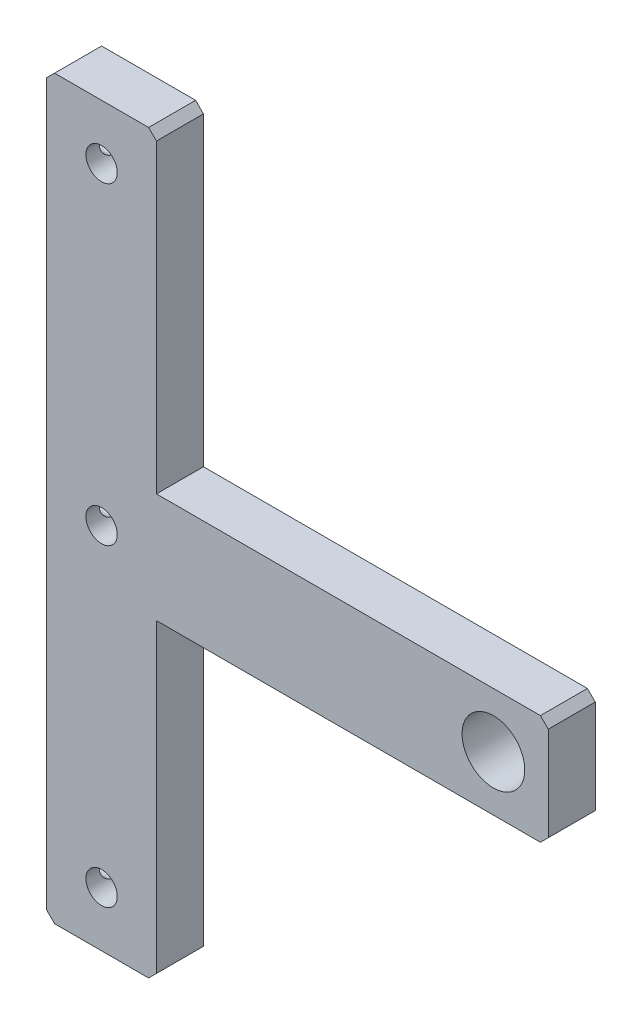
ISO-10303-21;
HEADER;
FILE_DESCRIPTION(('STEP AP214'),'2;1');
FILE_NAME('part.step','',(''),(''),'','','');
FILE_SCHEMA(('AUTOMOTIVE_DESIGN { 1 0 10303 214 1 1 1 1 }'));
ENDSEC;
DATA;
#1=APPLICATION_CONTEXT('core data for automotive mechanical design processes');
#2=APPLICATION_PROTOCOL_DEFINITION('international standard','automotive_design',2000,#1);
#3=PRODUCT_CONTEXT('',#1,'mechanical');
#4=PRODUCT('Part','Part','',(#3));
#5=PRODUCT_RELATED_PRODUCT_CATEGORY('part','',(#4));
#6=PRODUCT_DEFINITION_FORMATION('','',#4);
#7=PRODUCT_DEFINITION_CONTEXT('part definition',#1,'design');
#8=PRODUCT_DEFINITION('design','',#6,#7);
#9=PRODUCT_DEFINITION_SHAPE('','',#8);
#10=(LENGTH_UNIT() NAMED_UNIT(*) SI_UNIT(.MILLI.,.METRE.));
#11=(NAMED_UNIT(*) PLANE_ANGLE_UNIT() SI_UNIT($,.RADIAN.));
#12=(NAMED_UNIT(*) SI_UNIT($,.STERADIAN.) SOLID_ANGLE_UNIT());
#13=UNCERTAINTY_MEASURE_WITH_UNIT(LENGTH_MEASURE(1.E-05),#10,'distance_accuracy_value','');
#14=(GEOMETRIC_REPRESENTATION_CONTEXT(3) GLOBAL_UNCERTAINTY_ASSIGNED_CONTEXT((#13)) GLOBAL_UNIT_ASSIGNED_CONTEXT((#10,
#11,#12)) REPRESENTATION_CONTEXT('',''));
#15=CARTESIAN_POINT('',(0.,0.,0.));
#16=DIRECTION('',(0.,0.,1.));
#17=DIRECTION('',(1.,0.,0.));
#18=AXIS2_PLACEMENT_3D('',#15,#16,#17);
#19=CARTESIAN_POINT('',(0.,-47.,6.));
#20=DIRECTION('',(1.,0.,0.));
#21=DIRECTION('',(0.,1.,0.));
#22=AXIS2_PLACEMENT_3D('',#19,#20,#21);
#23=PLANE('',#22);
#24=DIRECTION('',(0.,-1.,0.));
#25=VECTOR('',#24,1.);
#26=CARTESIAN_POINT('',(0.,-47.,0.));
#27=LINE('',#26,#25);
#28=CARTESIAN_POINT('',(0.,46.,0.));
#29=VERTEX_POINT('',#28);
#30=CARTESIAN_POINT('',(0.,-46.,0.));
#31=VERTEX_POINT('',#30);
#32=EDGE_CURVE('E192',#29,#31,#27,.T.);
#33=ORIENTED_EDGE('',*,*,#32,.T.);
#34=DIRECTION('',(0.,0.,1.));
#35=VECTOR('',#34,1.);
#36=CARTESIAN_POINT('',(0.,-46.,6.));
#37=LINE('',#36,#35);
#38=CARTESIAN_POINT('',(0.,-46.,6.));
#39=VERTEX_POINT('',#38);
#40=EDGE_CURVE('E227',#31,#39,#37,.T.);
#41=ORIENTED_EDGE('',*,*,#40,.T.);
#42=DIRECTION('',(0.,-1.,0.));
#43=VECTOR('',#42,1.);
#44=CARTESIAN_POINT('',(0.,-47.,6.));
#45=LINE('',#44,#43);
#46=CARTESIAN_POINT('',(0.,46.,6.));
#47=VERTEX_POINT('',#46);
#48=EDGE_CURVE('E273',#47,#39,#45,.T.);
#49=ORIENTED_EDGE('',*,*,#48,.F.);
#50=DIRECTION('',(0.,0.,-1.));
#51=VECTOR('',#50,1.);
#52=CARTESIAN_POINT('',(0.,46.,6.));
#53=LINE('',#52,#51);
#54=EDGE_CURVE('E224',#47,#29,#53,.T.);
#55=ORIENTED_EDGE('',*,*,#54,.T.);
#56=EDGE_LOOP('',(#33,#41,#49,#55));
#57=FACE_BOUND('',#56,.T.);
#58=CARTESIAN_POINT('',(0.,0.,3.));
#59=DIRECTION('',(-1.,0.,0.));
#60=DIRECTION('',(0.,0.,1.));
#61=AXIS2_PLACEMENT_3D('',#58,#59,#60);
#62=CIRCLE('',#61,1.24999999999999);
#63=CARTESIAN_POINT('',(0.,0.,4.24999999999999));
#64=VERTEX_POINT('',#63);
#65=EDGE_CURVE('E311',#64,#64,#62,.T.);
#66=ORIENTED_EDGE('',*,*,#65,.F.);
#67=EDGE_LOOP('',(#66));
#68=FACE_BOUND('',#67,.T.);
#69=CARTESIAN_POINT('',(0.,40.,3.));
#70=DIRECTION('',(-1.,0.,0.));
#71=DIRECTION('',(0.,0.,1.));
#72=AXIS2_PLACEMENT_3D('',#69,#70,#71);
#73=CIRCLE('',#72,1.24999999999999);
#74=CARTESIAN_POINT('',(0.,40.,4.24999999999999));
#75=VERTEX_POINT('',#74);
#76=EDGE_CURVE('E332',#75,#75,#73,.T.);
#77=ORIENTED_EDGE('',*,*,#76,.F.);
#78=EDGE_LOOP('',(#77));
#79=FACE_BOUND('',#78,.T.);
#80=CARTESIAN_POINT('',(0.,-40.,3.));
#81=DIRECTION('',(-1.,0.,0.));
#82=DIRECTION('',(0.,0.,1.));
#83=AXIS2_PLACEMENT_3D('',#80,#81,#82);
#84=CIRCLE('',#83,1.24999999999999);
#85=CARTESIAN_POINT('',(0.,-40.,4.24999999999999));
#86=VERTEX_POINT('',#85);
#87=EDGE_CURVE('E342',#86,#86,#84,.T.);
#88=ORIENTED_EDGE('',*,*,#87,.F.);
#89=EDGE_LOOP('',(#88));
#90=FACE_BOUND('',#89,.T.);
#91=ADVANCED_FACE('F47',(#57,#68,#79,#90),#23,.F.);
#92=CARTESIAN_POINT('',(14.,47.,6.));
#93=DIRECTION('',(-1.,0.,0.));
#94=DIRECTION('',(0.,-1.,0.));
#95=AXIS2_PLACEMENT_3D('',#92,#93,#94);
#96=PLANE('',#95);
#97=DIRECTION('',(0.,1.,0.));
#98=VECTOR('',#97,1.);
#99=CARTESIAN_POINT('',(14.,47.,0.));
#100=LINE('',#99,#98);
#101=CARTESIAN_POINT('',(14.,7.,0.));
#102=VERTEX_POINT('',#101);
#103=CARTESIAN_POINT('',(14.,46.,0.));
#104=VERTEX_POINT('',#103);
#105=EDGE_CURVE('E185',#102,#104,#100,.T.);
#106=ORIENTED_EDGE('',*,*,#105,.T.);
#107=DIRECTION('',(0.,0.,1.));
#108=VECTOR('',#107,1.);
#109=CARTESIAN_POINT('',(14.,46.,6.));
#110=LINE('',#109,#108);
#111=CARTESIAN_POINT('',(14.,46.,6.));
#112=VERTEX_POINT('',#111);
#113=EDGE_CURVE('E11',#104,#112,#110,.T.);
#114=ORIENTED_EDGE('',*,*,#113,.T.);
#115=DIRECTION('',(0.,1.,0.));
#116=VECTOR('',#115,1.);
#117=CARTESIAN_POINT('',(14.,47.,6.));
#118=LINE('',#117,#116);
#119=CARTESIAN_POINT('',(14.,7.,6.));
#120=VERTEX_POINT('',#119);
#121=EDGE_CURVE('E205',#120,#112,#118,.T.);
#122=ORIENTED_EDGE('',*,*,#121,.F.);
#123=DIRECTION('',(0.,0.,-1.));
#124=VECTOR('',#123,1.);
#125=CARTESIAN_POINT('',(14.,7.,6.));
#126=LINE('',#125,#124);
#127=EDGE_CURVE('E173',#120,#102,#126,.T.);
#128=ORIENTED_EDGE('',*,*,#127,.T.);
#129=EDGE_LOOP('',(#106,#114,#122,#128));
#130=FACE_BOUND('',#129,.T.);
#131=ADVANCED_FACE('F360',(#130),#96,.F.);
#132=CARTESIAN_POINT('',(0.,47.,6.));
#133=DIRECTION('',(0.,-1.,0.));
#134=DIRECTION('',(0.,0.,-1.));
#135=AXIS2_PLACEMENT_3D('',#132,#133,#134);
#136=PLANE('',#135);
#137=DIRECTION('',(-1.,0.,0.));
#138=VECTOR('',#137,1.);
#139=CARTESIAN_POINT('',(0.,47.,6.));
#140=LINE('',#139,#138);
#141=CARTESIAN_POINT('',(13.,47.,6.));
#142=VERTEX_POINT('',#141);
#143=CARTESIAN_POINT('',(0.999999999999984,47.,6.));
#144=VERTEX_POINT('',#143);
#145=EDGE_CURVE('E258',#142,#144,#140,.T.);
#146=ORIENTED_EDGE('',*,*,#145,.F.);
#147=DIRECTION('',(0.,0.,-1.));
#148=VECTOR('',#147,1.);
#149=CARTESIAN_POINT('',(13.,47.,6.));
#150=LINE('',#149,#148);
#151=CARTESIAN_POINT('',(13.,47.,0.));
#152=VERTEX_POINT('',#151);
#153=EDGE_CURVE('E56',#142,#152,#150,.T.);
#154=ORIENTED_EDGE('',*,*,#153,.T.);
#155=DIRECTION('',(-1.,0.,0.));
#156=VECTOR('',#155,1.);
#157=CARTESIAN_POINT('',(0.,47.,0.));
#158=LINE('',#157,#156);
#159=CARTESIAN_POINT('',(0.999999999999984,47.,0.));
#160=VERTEX_POINT('',#159);
#161=EDGE_CURVE('E188',#152,#160,#158,.T.);
#162=ORIENTED_EDGE('',*,*,#161,.T.);
#163=DIRECTION('',(0.,0.,1.));
#164=VECTOR('',#163,1.);
#165=CARTESIAN_POINT('',(0.999999999999984,47.,6.));
#166=LINE('',#165,#164);
#167=EDGE_CURVE('E249',#160,#144,#166,.T.);
#168=ORIENTED_EDGE('',*,*,#167,.T.);
#169=EDGE_LOOP('',(#146,#154,#162,#168));
#170=FACE_BOUND('',#169,.T.);
#171=ADVANCED_FACE('F255',(#170),#136,.F.);
#172=CARTESIAN_POINT('',(0.,-47.,6.));
#173=DIRECTION('',(0.,1.,0.));
#174=DIRECTION('',(0.,0.,1.));
#175=AXIS2_PLACEMENT_3D('',#172,#173,#174);
#176=PLANE('',#175);
#177=DIRECTION('',(1.,0.,0.));
#178=VECTOR('',#177,1.);
#179=CARTESIAN_POINT('',(0.,-47.,6.));
#180=LINE('',#179,#178);
#181=CARTESIAN_POINT('',(1.,-47.,6.));
#182=VERTEX_POINT('',#181);
#183=CARTESIAN_POINT('',(13.,-47.,6.));
#184=VERTEX_POINT('',#183);
#185=EDGE_CURVE('E162',#182,#184,#180,.T.);
#186=ORIENTED_EDGE('',*,*,#185,.F.);
#187=DIRECTION('',(0.,0.,-1.));
#188=VECTOR('',#187,1.);
#189=CARTESIAN_POINT('',(1.,-47.,6.));
#190=LINE('',#189,#188);
#191=CARTESIAN_POINT('',(1.,-47.,0.));
#192=VERTEX_POINT('',#191);
#193=EDGE_CURVE('E209',#182,#192,#190,.T.);
#194=ORIENTED_EDGE('',*,*,#193,.T.);
#195=DIRECTION('',(1.,0.,0.));
#196=VECTOR('',#195,1.);
#197=CARTESIAN_POINT('',(0.,-47.,0.));
#198=LINE('',#197,#196);
#199=CARTESIAN_POINT('',(13.,-47.,0.));
#200=VERTEX_POINT('',#199);
#201=EDGE_CURVE('E195',#192,#200,#198,.T.);
#202=ORIENTED_EDGE('',*,*,#201,.T.);
#203=DIRECTION('',(0.,0.,1.));
#204=VECTOR('',#203,1.);
#205=CARTESIAN_POINT('',(13.,-47.,6.));
#206=LINE('',#205,#204);
#207=EDGE_CURVE('E172',#200,#184,#206,.T.);
#208=ORIENTED_EDGE('',*,*,#207,.T.);
#209=EDGE_LOOP('',(#186,#194,#202,#208));
#210=FACE_BOUND('',#209,.T.);
#211=ADVANCED_FACE('F370',(#210),#176,.F.);
#212=CARTESIAN_POINT('',(14.,-47.,6.));
#213=DIRECTION('',(-1.,0.,0.));
#214=DIRECTION('',(0.,0.,1.));
#215=AXIS2_PLACEMENT_3D('',#212,#213,#214);
#216=PLANE('',#215);
#217=DIRECTION('',(0.,1.,0.));
#218=VECTOR('',#217,1.);
#219=CARTESIAN_POINT('',(14.,-47.,6.));
#220=LINE('',#219,#218);
#221=CARTESIAN_POINT('',(14.,-46.,6.));
#222=VERTEX_POINT('',#221);
#223=CARTESIAN_POINT('',(14.,-7.,6.));
#224=VERTEX_POINT('',#223);
#225=EDGE_CURVE('E149',#222,#224,#220,.T.);
#226=ORIENTED_EDGE('',*,*,#225,.F.);
#227=DIRECTION('',(0.,0.,-1.));
#228=VECTOR('',#227,1.);
#229=CARTESIAN_POINT('',(14.,-46.,6.));
#230=LINE('',#229,#228);
#231=CARTESIAN_POINT('',(14.,-46.,0.));
#232=VERTEX_POINT('',#231);
#233=EDGE_CURVE('E239',#222,#232,#230,.T.);
#234=ORIENTED_EDGE('',*,*,#233,.T.);
#235=DIRECTION('',(0.,1.,0.));
#236=VECTOR('',#235,1.);
#237=CARTESIAN_POINT('',(14.,-47.,0.));
#238=LINE('',#237,#236);
#239=CARTESIAN_POINT('',(14.,-7.,0.));
#240=VERTEX_POINT('',#239);
#241=EDGE_CURVE('E168',#232,#240,#238,.T.);
#242=ORIENTED_EDGE('',*,*,#241,.T.);
#243=DIRECTION('',(0.,0.,-1.));
#244=VECTOR('',#243,1.);
#245=CARTESIAN_POINT('',(14.,-7.,6.));
#246=LINE('',#245,#244);
#247=EDGE_CURVE('E165',#224,#240,#246,.T.);
#248=ORIENTED_EDGE('',*,*,#247,.F.);
#249=EDGE_LOOP('',(#226,#234,#242,#248));
#250=FACE_BOUND('',#249,.T.);
#251=ADVANCED_FACE('F166',(#250),#216,.F.);
#252=CARTESIAN_POINT('',(14.,-7.,6.));
#253=DIRECTION('',(0.,1.,0.));
#254=DIRECTION('',(0.,0.,1.));
#255=AXIS2_PLACEMENT_3D('',#252,#253,#254);
#256=PLANE('',#255);
#257=DIRECTION('',(1.,0.,0.));
#258=VECTOR('',#257,1.);
#259=CARTESIAN_POINT('',(14.,-7.,0.));
#260=LINE('',#259,#258);
#261=CARTESIAN_POINT('',(63.,-7.,0.));
#262=VERTEX_POINT('',#261);
#263=EDGE_CURVE('E199',#240,#262,#260,.T.);
#264=ORIENTED_EDGE('',*,*,#263,.T.);
#265=DIRECTION('',(0.,0.,1.));
#266=VECTOR('',#265,1.);
#267=CARTESIAN_POINT('',(63.,-7.,6.));
#268=LINE('',#267,#266);
#269=CARTESIAN_POINT('',(63.,-7.,6.));
#270=VERTEX_POINT('',#269);
#271=EDGE_CURVE('E177',#262,#270,#268,.T.);
#272=ORIENTED_EDGE('',*,*,#271,.T.);
#273=DIRECTION('',(1.,0.,0.));
#274=VECTOR('',#273,1.);
#275=CARTESIAN_POINT('',(14.,-7.,6.));
#276=LINE('',#275,#274);
#277=EDGE_CURVE('E154',#224,#270,#276,.T.);
#278=ORIENTED_EDGE('',*,*,#277,.F.);
#279=ORIENTED_EDGE('',*,*,#247,.T.);
#280=EDGE_LOOP('',(#264,#272,#278,#279));
#281=FACE_BOUND('',#280,.T.);
#282=ADVANCED_FACE('F175',(#281),#256,.F.);
#283=CARTESIAN_POINT('',(64.,7.,6.));
#284=DIRECTION('',(-1.,0.,0.));
#285=DIRECTION('',(0.,0.,1.));
#286=AXIS2_PLACEMENT_3D('',#283,#284,#285);
#287=PLANE('',#286);
#288=DIRECTION('',(0.,1.,0.));
#289=VECTOR('',#288,1.);
#290=CARTESIAN_POINT('',(64.,7.,6.));
#291=LINE('',#290,#289);
#292=CARTESIAN_POINT('',(64.,-5.99999999999998,6.));
#293=VERTEX_POINT('',#292);
#294=CARTESIAN_POINT('',(64.,6.00000000000001,6.));
#295=VERTEX_POINT('',#294);
#296=EDGE_CURVE('E178',#293,#295,#291,.T.);
#297=ORIENTED_EDGE('',*,*,#296,.F.);
#298=DIRECTION('',(0.,0.,-1.));
#299=VECTOR('',#298,1.);
#300=CARTESIAN_POINT('',(64.,-5.99999999999998,6.));
#301=LINE('',#300,#299);
#302=CARTESIAN_POINT('',(64.,-5.99999999999998,0.));
#303=VERTEX_POINT('',#302);
#304=EDGE_CURVE('E242',#293,#303,#301,.T.);
#305=ORIENTED_EDGE('',*,*,#304,.T.);
#306=DIRECTION('',(0.,1.,0.));
#307=VECTOR('',#306,1.);
#308=CARTESIAN_POINT('',(64.,7.,0.));
#309=LINE('',#308,#307);
#310=CARTESIAN_POINT('',(64.,6.00000000000001,0.));
#311=VERTEX_POINT('',#310);
#312=EDGE_CURVE('E201',#303,#311,#309,.T.);
#313=ORIENTED_EDGE('',*,*,#312,.T.);
#314=DIRECTION('',(0.,0.,1.));
#315=VECTOR('',#314,1.);
#316=CARTESIAN_POINT('',(64.,6.00000000000001,6.));
#317=LINE('',#316,#315);
#318=EDGE_CURVE('E71',#311,#295,#317,.T.);
#319=ORIENTED_EDGE('',*,*,#318,.T.);
#320=EDGE_LOOP('',(#297,#305,#313,#319));
#321=FACE_BOUND('',#320,.T.);
#322=ADVANCED_FACE('F413',(#321),#287,.F.);
#323=CARTESIAN_POINT('',(14.,7.,6.));
#324=DIRECTION('',(0.,-1.,0.));
#325=DIRECTION('',(0.,0.,-1.));
#326=AXIS2_PLACEMENT_3D('',#323,#324,#325);
#327=PLANE('',#326);
#328=DIRECTION('',(-1.,0.,0.));
#329=VECTOR('',#328,1.);
#330=CARTESIAN_POINT('',(14.,7.,6.));
#331=LINE('',#330,#329);
#332=CARTESIAN_POINT('',(63.,7.,6.));
#333=VERTEX_POINT('',#332);
#334=EDGE_CURVE('E180',#333,#120,#331,.T.);
#335=ORIENTED_EDGE('',*,*,#334,.F.);
#336=DIRECTION('',(0.,0.,-1.));
#337=VECTOR('',#336,1.);
#338=CARTESIAN_POINT('',(63.,7.,6.));
#339=LINE('',#338,#337);
#340=CARTESIAN_POINT('',(63.,7.,0.));
#341=VERTEX_POINT('',#340);
#342=EDGE_CURVE('E246',#333,#341,#339,.T.);
#343=ORIENTED_EDGE('',*,*,#342,.T.);
#344=DIRECTION('',(-1.,0.,0.));
#345=VECTOR('',#344,1.);
#346=CARTESIAN_POINT('',(14.,7.,0.));
#347=LINE('',#346,#345);
#348=EDGE_CURVE('E203',#341,#102,#347,.T.);
#349=ORIENTED_EDGE('',*,*,#348,.T.);
#350=ORIENTED_EDGE('',*,*,#127,.F.);
#351=EDGE_LOOP('',(#335,#343,#349,#350));
#352=FACE_BOUND('',#351,.T.);
#353=ADVANCED_FACE('F410',(#352),#327,.F.);
#354=CARTESIAN_POINT('',(0.,0.,6.));
#355=DIRECTION('',(0.,0.,1.));
#356=DIRECTION('',(1.,0.,0.));
#357=AXIS2_PLACEMENT_3D('',#354,#355,#356);
#358=PLANE('',#357);
#359=CARTESIAN_POINT('',(6.99999999999998,40.,6.));
#360=DIRECTION('',(0.,0.,1.));
#361=DIRECTION('',(1.,0.,0.));
#362=AXIS2_PLACEMENT_3D('',#359,#360,#361);
#363=CIRCLE('',#362,2.);
#364=CARTESIAN_POINT('',(8.99999999999998,40.,6.));
#365=VERTEX_POINT('',#364);
#366=EDGE_CURVE('E299',#365,#365,#363,.T.);
#367=ORIENTED_EDGE('',*,*,#366,.F.);
#368=EDGE_LOOP('',(#367));
#369=FACE_BOUND('',#368,.T.);
#370=CARTESIAN_POINT('',(7.,-40.,6.));
#371=DIRECTION('',(0.,0.,1.));
#372=DIRECTION('',(1.,0.,0.));
#373=AXIS2_PLACEMENT_3D('',#370,#371,#372);
#374=CIRCLE('',#373,2.);
#375=CARTESIAN_POINT('',(9.,-40.,6.));
#376=VERTEX_POINT('',#375);
#377=EDGE_CURVE('E296',#376,#376,#374,.T.);
#378=ORIENTED_EDGE('',*,*,#377,.F.);
#379=EDGE_LOOP('',(#378));
#380=FACE_BOUND('',#379,.T.);
#381=CARTESIAN_POINT('',(6.99999999999998,0.,6.));
#382=DIRECTION('',(0.,0.,1.));
#383=DIRECTION('',(1.,0.,0.));
#384=AXIS2_PLACEMENT_3D('',#381,#382,#383);
#385=CIRCLE('',#384,2.);
#386=CARTESIAN_POINT('',(8.99999999999998,0.,6.));
#387=VERTEX_POINT('',#386);
#388=EDGE_CURVE('E290',#387,#387,#385,.T.);
#389=ORIENTED_EDGE('',*,*,#388,.F.);
#390=EDGE_LOOP('',(#389));
#391=FACE_BOUND('',#390,.T.);
#392=CARTESIAN_POINT('',(57.,0.,6.));
#393=DIRECTION('',(0.,0.,1.));
#394=DIRECTION('',(1.,0.,0.));
#395=AXIS2_PLACEMENT_3D('',#392,#393,#394);
#396=CIRCLE('',#395,4.);
#397=CARTESIAN_POINT('',(61.,0.,6.));
#398=VERTEX_POINT('',#397);
#399=EDGE_CURVE('E283',#398,#398,#396,.T.);
#400=ORIENTED_EDGE('',*,*,#399,.F.);
#401=EDGE_LOOP('',(#400));
#402=FACE_BOUND('',#401,.T.);
#403=ORIENTED_EDGE('',*,*,#48,.T.);
#404=DIRECTION('',(-0.707106781186548,0.707106781186548,0.));
#405=VECTOR('',#404,1.);
#406=CARTESIAN_POINT('',(-23.,-23.,6.));
#407=LINE('',#406,#405);
#408=EDGE_CURVE('E237',#39,#182,#407,.F.);
#409=ORIENTED_EDGE('',*,*,#408,.T.);
#410=ORIENTED_EDGE('',*,*,#185,.T.);
#411=DIRECTION('',(-0.707106781186552,-0.707106781186543,0.));
#412=VECTOR('',#411,1.);
#413=CARTESIAN_POINT('',(29.9999999999999,-30.0000000000003,6.));
#414=LINE('',#413,#412);
#415=EDGE_CURVE('E158',#184,#222,#414,.F.);
#416=ORIENTED_EDGE('',*,*,#415,.T.);
#417=ORIENTED_EDGE('',*,*,#225,.T.);
#418=ORIENTED_EDGE('',*,*,#277,.T.);
#419=DIRECTION('',(-0.707106781186548,-0.707106781186548,0.));
#420=VECTOR('',#419,1.);
#421=CARTESIAN_POINT('',(35.,-35.,6.));
#422=LINE('',#421,#420);
#423=EDGE_CURVE('E234',#270,#293,#422,.F.);
#424=ORIENTED_EDGE('',*,*,#423,.T.);
#425=ORIENTED_EDGE('',*,*,#296,.T.);
#426=DIRECTION('',(0.707106781186548,-0.707106781186548,0.));
#427=VECTOR('',#426,1.);
#428=CARTESIAN_POINT('',(35.,35.,6.));
#429=LINE('',#428,#427);
#430=EDGE_CURVE('E63',#295,#333,#429,.F.);
#431=ORIENTED_EDGE('',*,*,#430,.T.);
#432=ORIENTED_EDGE('',*,*,#334,.T.);
#433=ORIENTED_EDGE('',*,*,#121,.T.);
#434=DIRECTION('',(0.707106781186548,-0.707106781186548,0.));
#435=VECTOR('',#434,1.);
#436=CARTESIAN_POINT('',(30.,30.,6.));
#437=LINE('',#436,#435);
#438=EDGE_CURVE('E231',#112,#142,#437,.F.);
#439=ORIENTED_EDGE('',*,*,#438,.T.);
#440=ORIENTED_EDGE('',*,*,#145,.T.);
#441=DIRECTION('',(0.707106781186548,0.707106781186548,0.));
#442=VECTOR('',#441,1.);
#443=CARTESIAN_POINT('',(-23.,23.,6.));
#444=LINE('',#443,#442);
#445=EDGE_CURVE('E229',#144,#47,#444,.F.);
#446=ORIENTED_EDGE('',*,*,#445,.T.);
#447=EDGE_LOOP('',(#403,#409,#410,#416,#417,#418,#424,#425,#431,#432,#433,#439,#440,#446));
#448=FACE_BOUND('',#447,.T.);
#449=ADVANCED_FACE('F152',(#369,#380,#391,#402,#448),#358,.T.);
#450=CARTESIAN_POINT('',(0.,0.,0.));
#451=DIRECTION('',(0.,0.,1.));
#452=DIRECTION('',(1.,0.,0.));
#453=AXIS2_PLACEMENT_3D('',#450,#451,#452);
#454=PLANE('',#453);
#455=CARTESIAN_POINT('',(6.99999999999998,40.,0.));
#456=DIRECTION('',(0.,0.,1.));
#457=DIRECTION('',(1.,0.,0.));
#458=AXIS2_PLACEMENT_3D('',#455,#456,#457);
#459=CIRCLE('',#458,2.);
#460=CARTESIAN_POINT('',(8.99999999999998,40.,0.));
#461=VERTEX_POINT('',#460);
#462=EDGE_CURVE('E189',#461,#461,#459,.T.);
#463=ORIENTED_EDGE('',*,*,#462,.T.);
#464=EDGE_LOOP('',(#463));
#465=FACE_BOUND('',#464,.T.);
#466=CARTESIAN_POINT('',(7.,-40.,0.));
#467=DIRECTION('',(0.,0.,1.));
#468=DIRECTION('',(1.,0.,0.));
#469=AXIS2_PLACEMENT_3D('',#466,#467,#468);
#470=CIRCLE('',#469,2.);
#471=CARTESIAN_POINT('',(9.,-40.,0.));
#472=VERTEX_POINT('',#471);
#473=EDGE_CURVE('E293',#472,#472,#470,.T.);
#474=ORIENTED_EDGE('',*,*,#473,.T.);
#475=EDGE_LOOP('',(#474));
#476=FACE_BOUND('',#475,.T.);
#477=CARTESIAN_POINT('',(6.99999999999998,0.,0.));
#478=DIRECTION('',(0.,0.,1.));
#479=DIRECTION('',(1.,0.,0.));
#480=AXIS2_PLACEMENT_3D('',#477,#478,#479);
#481=CIRCLE('',#480,2.);
#482=CARTESIAN_POINT('',(8.99999999999998,0.,0.));
#483=VERTEX_POINT('',#482);
#484=EDGE_CURVE('E287',#483,#483,#481,.T.);
#485=ORIENTED_EDGE('',*,*,#484,.T.);
#486=EDGE_LOOP('',(#485));
#487=FACE_BOUND('',#486,.T.);
#488=CARTESIAN_POINT('',(57.,0.,0.));
#489=DIRECTION('',(0.,0.,1.));
#490=DIRECTION('',(1.,0.,0.));
#491=AXIS2_PLACEMENT_3D('',#488,#489,#490);
#492=CIRCLE('',#491,4.);
#493=CARTESIAN_POINT('',(61.,0.,0.));
#494=VERTEX_POINT('',#493);
#495=EDGE_CURVE('E280',#494,#494,#492,.T.);
#496=ORIENTED_EDGE('',*,*,#495,.T.);
#497=EDGE_LOOP('',(#496));
#498=FACE_BOUND('',#497,.T.);
#499=ORIENTED_EDGE('',*,*,#201,.F.);
#500=DIRECTION('',(0.707106781186548,-0.707106781186548,0.));
#501=VECTOR('',#500,1.);
#502=CARTESIAN_POINT('',(1.,-47.,0.));
#503=LINE('',#502,#501);
#504=EDGE_CURVE('E222',#192,#31,#503,.F.);
#505=ORIENTED_EDGE('',*,*,#504,.T.);
#506=ORIENTED_EDGE('',*,*,#32,.F.);
#507=DIRECTION('',(-0.707106781186548,-0.707106781186548,0.));
#508=VECTOR('',#507,1.);
#509=CARTESIAN_POINT('',(0.,46.,0.));
#510=LINE('',#509,#508);
#511=EDGE_CURVE('E212',#29,#160,#510,.F.);
#512=ORIENTED_EDGE('',*,*,#511,.T.);
#513=ORIENTED_EDGE('',*,*,#161,.F.);
#514=DIRECTION('',(-0.707106781186548,0.707106781186548,0.));
#515=VECTOR('',#514,1.);
#516=CARTESIAN_POINT('',(13.,47.,0.));
#517=LINE('',#516,#515);
#518=EDGE_CURVE('E214',#152,#104,#517,.F.);
#519=ORIENTED_EDGE('',*,*,#518,.T.);
#520=ORIENTED_EDGE('',*,*,#105,.F.);
#521=ORIENTED_EDGE('',*,*,#348,.F.);
#522=DIRECTION('',(-0.707106781186548,0.707106781186548,0.));
#523=VECTOR('',#522,1.);
#524=CARTESIAN_POINT('',(63.,7.,0.));
#525=LINE('',#524,#523);
#526=EDGE_CURVE('E216',#341,#311,#525,.F.);
#527=ORIENTED_EDGE('',*,*,#526,.T.);
#528=ORIENTED_EDGE('',*,*,#312,.F.);
#529=DIRECTION('',(0.707106781186548,0.707106781186548,0.));
#530=VECTOR('',#529,1.);
#531=CARTESIAN_POINT('',(64.,-5.99999999999998,0.));
#532=LINE('',#531,#530);
#533=EDGE_CURVE('E218',#303,#262,#532,.F.);
#534=ORIENTED_EDGE('',*,*,#533,.T.);
#535=ORIENTED_EDGE('',*,*,#263,.F.);
#536=ORIENTED_EDGE('',*,*,#241,.F.);
#537=DIRECTION('',(0.707106781186552,0.707106781186543,0.));
#538=VECTOR('',#537,1.);
#539=CARTESIAN_POINT('',(14.,-46.,0.));
#540=LINE('',#539,#538);
#541=EDGE_CURVE('E220',#232,#200,#540,.F.);
#542=ORIENTED_EDGE('',*,*,#541,.T.);
#543=EDGE_LOOP('',(#499,#505,#506,#512,#513,#519,#520,#521,#527,#528,#534,#535,#536,#542));
#544=FACE_BOUND('',#543,.T.);
#545=ADVANCED_FACE('F263',(#465,#476,#487,#498,#544),#454,.F.);
#546=CARTESIAN_POINT('',(57.,0.,0.));
#547=DIRECTION('',(0.,0.,1.));
#548=DIRECTION('',(1.,0.,0.));
#549=AXIS2_PLACEMENT_3D('',#546,#547,#548);
#550=CYLINDRICAL_SURFACE('',#549,4.);
#551=ORIENTED_EDGE('',*,*,#495,.F.);
#552=EDGE_LOOP('',(#551));
#553=FACE_BOUND('',#552,.T.);
#554=ORIENTED_EDGE('',*,*,#399,.T.);
#555=EDGE_LOOP('',(#554));
#556=FACE_BOUND('',#555,.T.);
#557=ADVANCED_FACE('F480',(#553,#556),#550,.F.);
#558=CARTESIAN_POINT('',(6.99999999999998,0.,0.));
#559=DIRECTION('',(0.,0.,1.));
#560=DIRECTION('',(1.,0.,0.));
#561=AXIS2_PLACEMENT_3D('',#558,#559,#560);
#562=CYLINDRICAL_SURFACE('',#561,2.);
#563=CARTESIAN_POINT('',(4.99999999999998,0.,4.24999999999999));
#564=CARTESIAN_POINT('',(5.00000404694686,0.0635104730002022,4.24999565000121));
#565=CARTESIAN_POINT('',(5.00305676688998,0.127096441053757,4.24512698818218));
#566=CARTESIAN_POINT('',(5.01497832275896,0.252318262265281,4.22591419657049));
#567=CARTESIAN_POINT('',(5.02385824425102,0.313950163299071,4.21155200607451));
#568=CARTESIAN_POINT('',(5.04654147017864,0.43320555813678,4.17418863683794));
#569=CARTESIAN_POINT('',(5.06032039221336,0.490847243665014,4.15123021215911));
#570=CARTESIAN_POINT('',(5.09165401513925,0.601260368868357,4.09761414920324));
#571=CARTESIAN_POINT('',(5.10920829764727,0.654032347276149,4.0669573639908));
#572=CARTESIAN_POINT('',(5.14829847097725,0.757974192167969,3.99611342681502));
#573=CARTESIAN_POINT('',(5.17004037775381,0.808679560769972,3.95536070002455));
#574=CARTESIAN_POINT('',(5.21468650086366,0.902986375146754,3.86678082549344));
#575=CARTESIAN_POINT('',(5.23759225141445,0.946578107215728,3.81894417174206));
#576=CARTESIAN_POINT('',(5.28569581344799,1.03142873237132,3.70996610579548));
#577=CARTESIAN_POINT('',(5.31078389006586,1.0715720602915,3.64790021339272));
#578=CARTESIAN_POINT('',(5.35669801871267,1.14073966020039,3.51643518455281));
#579=CARTESIAN_POINT('',(5.3775312400376,1.16978270899534,3.44704868742392));
#580=CARTESIAN_POINT('',(5.40690424372634,1.2093340058598,3.32118947622128));
#581=CARTESIAN_POINT('',(5.41723094009924,1.22269552371393,3.26603318146118));
#582=CARTESIAN_POINT('',(5.43218642674192,1.24181843585479,3.1536940743892));
#583=CARTESIAN_POINT('',(5.43682326326306,1.24759056342087,3.09651424172551));
#584=CARTESIAN_POINT('',(5.43970114217171,1.25118918245719,2.98158698324888));
#585=CARTESIAN_POINT('',(5.43792541228279,1.2489948372785,2.9238384635376));
#586=CARTESIAN_POINT('',(5.42822597616078,1.23676317046804,2.80968989681104));
#587=CARTESIAN_POINT('',(5.42029734232888,1.22671956265043,2.75329096796092));
#588=CARTESIAN_POINT('',(5.39967426878217,1.19968103371473,2.64456154734252));
#589=CARTESIAN_POINT('',(5.38709284895184,1.18285016736896,2.59216754431573));
#590=CARTESIAN_POINT('',(5.35854433556592,1.14290189820937,2.49083881759458));
#591=CARTESIAN_POINT('',(5.34257604498644,1.11978227193695,2.44190532512551));
#592=CARTESIAN_POINT('',(5.30545184006978,1.06294892954948,2.33916672616726));
#593=CARTESIAN_POINT('',(5.28388408424039,1.0280629660117,2.28615918987961));
#594=CARTESIAN_POINT('',(5.23994288208755,0.950881463002094,2.18616972099953));
#595=CARTESIAN_POINT('',(5.21756862664023,0.90857830801143,2.13919406829348));
#596=CARTESIAN_POINT('',(5.17020105083141,0.809519713023324,2.04469825062961));
#597=CARTESIAN_POINT('',(5.14538468323405,0.751531353595326,1.99836702574117));
#598=CARTESIAN_POINT('',(5.09971944937553,0.627148099593563,1.91614910411276));
#599=CARTESIAN_POINT('',(5.07886902485234,0.560756523881993,1.88025830227108));
#600=CARTESIAN_POINT('',(5.04446627038682,0.424883562934743,1.82223631161858));
#601=CARTESIAN_POINT('',(5.03058023408424,0.355763457732366,1.79946596001882));
#602=CARTESIAN_POINT('',(5.0101507068995,0.213612154574972,1.76623507201719));
#603=CARTESIAN_POINT('',(5.00359682009928,0.140586648341301,1.755757105778));
#604=CARTESIAN_POINT('',(4.99902159459907,0.00451561874058604,1.74843414993881));
#605=CARTESIAN_POINT('',(4.99987838654488,-0.058402774163787,1.74979682204615));
#606=CARTESIAN_POINT('',(5.00741098505672,-0.182972117996311,1.76188282842073));
#607=CARTESIAN_POINT('',(5.01408639526407,-0.244623154962734,1.77260552509217));
#608=CARTESIAN_POINT('',(5.03225947716929,-0.36252107065819,1.80223853669197));
#609=CARTESIAN_POINT('',(5.04355829473155,-0.418885009953204,1.82081215679666));
#610=CARTESIAN_POINT('',(5.07004315895247,-0.527638281070987,1.86529638927857));
#611=CARTESIAN_POINT('',(5.08522985649732,-0.580026945470714,1.89120823025516));
#612=CARTESIAN_POINT('',(5.12009987643998,-0.685084056277256,1.95251520599549));
#613=CARTESIAN_POINT('',(5.14008235182774,-0.737246967843403,1.98860356923824));
#614=CARTESIAN_POINT('',(5.18193029998282,-0.835142640217339,2.06779386515282));
#615=CARTESIAN_POINT('',(5.20379785173614,-0.880868151291852,2.11090358925455));
#616=CARTESIAN_POINT('',(5.25094130286907,-0.97147419802288,2.21013503941266));
#617=CARTESIAN_POINT('',(5.27625116585041,-1.01526851939752,2.26723720629479));
#618=CARTESIAN_POINT('',(5.32433237251826,-1.09280351885684,2.38887578494426));
#619=CARTESIAN_POINT('',(5.34710546677662,-1.12655115718693,2.453407006753));
#620=CARTESIAN_POINT('',(5.38266469685406,-1.17684772011827,2.57469214805689));
#621=CARTESIAN_POINT('',(5.39654363806218,-1.19551895865479,2.63024075073223));
#622=CARTESIAN_POINT('',(5.41894969336231,-1.22500108205244,2.74439314576893));
#623=CARTESIAN_POINT('',(5.42748516757392,-1.23582424983127,2.80299200945147));
#624=CARTESIAN_POINT('',(5.43793675011266,-1.24901383653653,2.92209027688069));
#625=CARTESIAN_POINT('',(5.43981498325429,-1.25133186963292,2.98259858548818));
#626=CARTESIAN_POINT('',(5.43650936890151,-1.24719778716817,3.10313096036604));
#627=CARTESIAN_POINT('',(5.43132317404412,-1.24074275650142,3.16315485900952));
#628=CARTESIAN_POINT('',(5.41544611228664,-1.22038272403399,3.27602979505136));
#629=CARTESIAN_POINT('',(5.40523191948938,-1.20711919499769,3.32906930141641));
#630=CARTESIAN_POINT('',(5.38082469564308,-1.17417623469512,3.43213505958591));
#631=CARTESIAN_POINT('',(5.3666300057627,-1.15449412799406,3.48216004453751));
#632=CARTESIAN_POINT('',(5.3333609711348,-1.10602690439617,3.5855967438727));
#633=CARTESIAN_POINT('',(5.31387769501001,-1.07633644455459,3.63845029847655));
#634=CARTESIAN_POINT('',(5.2733229358813,-1.01000017036389,3.73893836724601));
#635=CARTESIAN_POINT('',(5.25225017723173,-0.973348732866934,3.78656861256048));
#636=CARTESIAN_POINT('',(5.20598089268817,-0.885670221416053,3.88501425497784));
#637=CARTESIAN_POINT('',(5.18079458191222,-0.833233674246788,3.93459084544548));
#638=CARTESIAN_POINT('',(5.1330127094325,-0.719822446025197,4.02449482970524));
#639=CARTESIAN_POINT('',(5.11041875635603,-0.658842515138543,4.0648164959274));
#640=CARTESIAN_POINT('',(5.0701328902345,-0.529355399891402,4.1347711301241));
#641=CARTESIAN_POINT('',(5.05244928644642,-0.460835727056565,4.16438600540584));
#642=CARTESIAN_POINT('',(5.02418478362156,-0.318394712729494,4.21107188433174));
#643=CARTESIAN_POINT('',(5.01357878571309,-0.244493501106845,4.22818723486978));
#644=CARTESIAN_POINT('',(5.00480527831855,-0.14141848122466,4.24229920916262));
#645=CARTESIAN_POINT('',(5.00300827773697,-0.113248608862866,4.24518186533397));
#646=CARTESIAN_POINT('',(5.00060469786759,-0.0567241864870877,4.2490332915376));
#647=CARTESIAN_POINT('',(4.99999819226088,-0.0283696251514516,4.25000194310999));
#648=CARTESIAN_POINT('',(4.99999999999998,0.,4.24999999999999));
#649=B_SPLINE_CURVE_WITH_KNOTS('',3,(#563,#564,#565,#566,#567,#568,#569,#570,#571,#572,#573,
#574,#575,#576,#577,#578,#579,#580,#581,#582,#583,#584,#585,#586,#587,#588,#589,#590,#591,#592,
#593,#594,#595,#596,#597,#598,#599,#600,#601,#602,#603,#604,#605,#606,#607,#608,#609,#610,#611,
#612,#613,#614,#615,#616,#617,#618,#619,#620,#621,#622,#623,#624,#625,#626,#627,#628,#629,#630,
#631,#632,#633,#634,#635,#636,#637,#638,#639,#640,#641,#642,#643,#644,#645,#646,#647,#648),
.UNSPECIFIED.,.T.,.F.,(4,2,2,2,2,2,2,2,2,2,2,2,2,2,2,2,2,2,2,2,2,2,2,2,2,2,2,2,2,2,2,2,2,2,2,2,
2,2,2,2,2,2,4),(0.,0.190412301434131,0.38118789412846,0.571026987595133,0.760845054038791,
0.965821870536213,1.17107628325701,1.40412975852972,1.63678724607009,1.80912008879716,
1.9812089470739,2.15374823498777,2.32642584505082,2.49515839460435,2.66395067908032,
2.86427450354358,3.0648052257518,3.2984218069952,3.53194640727859,3.75284174135957,
3.97342347958129,4.16127180597571,4.34910733732278,4.52959504531296,4.71011298928464,
4.9088523099055,5.10781368827683,5.3356570886371,5.56334227196908,5.74329940313717,
5.92297427413349,6.10366974688197,6.28442527563861,6.45063169037737,6.61690747313439,
6.80725523036975,6.99775741153766,7.22600539035108,7.45439424578496,7.68316725607074,
7.91112460944404,7.99617501232476,8.08123067890583),.UNSPECIFIED.);
#650=CARTESIAN_POINT('',(4.99999999999998,0.,4.24999999999999));
#651=VERTEX_POINT('',#650);
#652=EDGE_CURVE('E284',#651,#651,#649,.T.);
#653=ORIENTED_EDGE('',*,*,#652,.T.);
#654=EDGE_LOOP('',(#653));
#655=FACE_BOUND('',#654,.T.);
#656=ORIENTED_EDGE('',*,*,#484,.F.);
#657=EDGE_LOOP('',(#656));
#658=FACE_BOUND('',#657,.T.);
#659=ORIENTED_EDGE('',*,*,#388,.T.);
#660=EDGE_LOOP('',(#659));
#661=FACE_BOUND('',#660,.T.);
#662=ADVANCED_FACE('F488',(#655,#658,#661),#562,.F.);
#663=CARTESIAN_POINT('',(7.,-40.,0.));
#664=DIRECTION('',(0.,0.,1.));
#665=DIRECTION('',(1.,0.,0.));
#666=AXIS2_PLACEMENT_3D('',#663,#664,#665);
#667=CYLINDRICAL_SURFACE('',#666,2.);
#668=CARTESIAN_POINT('',(5.,-40.,4.24999999999999));
#669=CARTESIAN_POINT('',(5.00000404694687,-39.9364895269998,4.24999565000121));
#670=CARTESIAN_POINT('',(5.00305676688999,-39.8729035589462,4.24512698818218));
#671=CARTESIAN_POINT('',(5.01497832275898,-39.7476817377347,4.22591419657049));
#672=CARTESIAN_POINT('',(5.02385824425104,-39.6860498367009,4.21155200607451));
#673=CARTESIAN_POINT('',(5.04654147017865,-39.5667944418632,4.17418863683794));
#674=CARTESIAN_POINT('',(5.06032039221337,-39.509152756335,4.15123021215911));
#675=CARTESIAN_POINT('',(5.09165401513927,-39.3987396311316,4.09761414920324));
#676=CARTESIAN_POINT('',(5.10920829764729,-39.3459676527239,4.0669573639908));
#677=CARTESIAN_POINT('',(5.14829847097727,-39.242025807832,3.99611342681502));
#678=CARTESIAN_POINT('',(5.17004037775383,-39.19132043923,3.95536070002455));
#679=CARTESIAN_POINT('',(5.21468650086368,-39.0970136248532,3.86678082549344));
#680=CARTESIAN_POINT('',(5.23759225141447,-39.0534218927843,3.81894417174206));
#681=CARTESIAN_POINT('',(5.28569581344801,-38.9685712676287,3.70996610579548));
#682=CARTESIAN_POINT('',(5.31078389006588,-38.9284279397085,3.64790021339272));
#683=CARTESIAN_POINT('',(5.35669801871269,-38.8592603397996,3.51643518455281));
#684=CARTESIAN_POINT('',(5.37753124003761,-38.8302172910047,3.44704868742392));
#685=CARTESIAN_POINT('',(5.40690424372635,-38.7906659941402,3.32118947622128));
#686=CARTESIAN_POINT('',(5.41723094009926,-38.7773044762861,3.26603318146118));
#687=CARTESIAN_POINT('',(5.43218642674194,-38.7581815641452,3.1536940743892));
#688=CARTESIAN_POINT('',(5.43682326326307,-38.7524094365791,3.09651424172551));
#689=CARTESIAN_POINT('',(5.43970114217172,-38.7488108175428,2.98158698324888));
#690=CARTESIAN_POINT('',(5.43792541228281,-38.7510051627215,2.9238384635376));
#691=CARTESIAN_POINT('',(5.4282259761608,-38.763236829532,2.80968989681104));
#692=CARTESIAN_POINT('',(5.42029734232889,-38.7732804373496,2.75329096796092));
#693=CARTESIAN_POINT('',(5.39967426878219,-38.8003189662853,2.64456154734253));
#694=CARTESIAN_POINT('',(5.38709284895186,-38.817149832631,2.59216754431573));
#695=CARTESIAN_POINT('',(5.35854433556594,-38.8570981017906,2.49083881759458));
#696=CARTESIAN_POINT('',(5.34257604498646,-38.8802177280631,2.44190532512551));
#697=CARTESIAN_POINT('',(5.3054518400698,-38.9370510704505,2.33916672616727));
#698=CARTESIAN_POINT('',(5.28388408424041,-38.9719370339883,2.28615918987961));
#699=CARTESIAN_POINT('',(5.23994288208756,-39.0491185369979,2.18616972099953));
#700=CARTESIAN_POINT('',(5.21756862664024,-39.0914216919886,2.13919406829348));
#701=CARTESIAN_POINT('',(5.17020105083143,-39.1904802869767,2.04469825062961));
#702=CARTESIAN_POINT('',(5.14538468323407,-39.2484686464047,1.99836702574117));
#703=CARTESIAN_POINT('',(5.09971944937555,-39.3728519004064,1.91614910411276));
#704=CARTESIAN_POINT('',(5.07886902485236,-39.439243476118,1.88025830227108));
#705=CARTESIAN_POINT('',(5.04446627038684,-39.5751164370653,1.82223631161858));
#706=CARTESIAN_POINT('',(5.03058023408426,-39.6442365422676,1.79946596001882));
#707=CARTESIAN_POINT('',(5.01015070689952,-39.786387845425,1.76623507201719));
#708=CARTESIAN_POINT('',(5.0035968200993,-39.8594133516587,1.755757105778));
#709=CARTESIAN_POINT('',(4.99902159459909,-39.9954843812594,1.74843414993881));
#710=CARTESIAN_POINT('',(4.99987838654489,-40.0584027741638,1.74979682204615));
#711=CARTESIAN_POINT('',(5.00741098505673,-40.1829721179963,1.76188282842073));
#712=CARTESIAN_POINT('',(5.01408639526408,-40.2446231549627,1.77260552509217));
#713=CARTESIAN_POINT('',(5.0322594771693,-40.3625210706582,1.80223853669197));
#714=CARTESIAN_POINT('',(5.04355829473156,-40.4188850099532,1.82081215679666));
#715=CARTESIAN_POINT('',(5.07004315895249,-40.527638281071,1.86529638927857));
#716=CARTESIAN_POINT('',(5.08522985649734,-40.5800269454707,1.89120823025516));
#717=CARTESIAN_POINT('',(5.12009987644,-40.6850840562773,1.95251520599549));
#718=CARTESIAN_POINT('',(5.14008235182775,-40.7372469678434,1.98860356923824));
#719=CARTESIAN_POINT('',(5.18193029998283,-40.8351426402173,2.06779386515281));
#720=CARTESIAN_POINT('',(5.20379785173616,-40.8808681512918,2.11090358925454));
#721=CARTESIAN_POINT('',(5.25094130286908,-40.9714741980229,2.21013503941265));
#722=CARTESIAN_POINT('',(5.27625116585043,-41.0152685193975,2.26723720629478));
#723=CARTESIAN_POINT('',(5.32433237251827,-41.0928035188568,2.38887578494426));
#724=CARTESIAN_POINT('',(5.34710546677663,-41.1265511571869,2.45340700675299));
#725=CARTESIAN_POINT('',(5.38266469685408,-41.1768477201183,2.57469214805688));
#726=CARTESIAN_POINT('',(5.3965436380622,-41.1955189586548,2.63024075073222));
#727=CARTESIAN_POINT('',(5.41894969336232,-41.2250010820524,2.74439314576892));
#728=CARTESIAN_POINT('',(5.42748516757394,-41.2358242498313,2.80299200945146));
#729=CARTESIAN_POINT('',(5.43793675011268,-41.2490138365365,2.92209027688069));
#730=CARTESIAN_POINT('',(5.43981498325431,-41.2513318696329,2.98259858548817));
#731=CARTESIAN_POINT('',(5.43650936890152,-41.2471977871682,3.10313096036604));
#732=CARTESIAN_POINT('',(5.43132317404414,-41.2407427565014,3.16315485900951));
#733=CARTESIAN_POINT('',(5.41544611228665,-41.220382724034,3.27602979505136));
#734=CARTESIAN_POINT('',(5.40523191948939,-41.2071191949977,3.32906930141641));
#735=CARTESIAN_POINT('',(5.38082469564309,-41.1741762346951,3.43213505958591));
#736=CARTESIAN_POINT('',(5.36663000576272,-41.1544941279941,3.4821600445375));
#737=CARTESIAN_POINT('',(5.33336097113481,-41.1060269043962,3.5855967438727));
#738=CARTESIAN_POINT('',(5.31387769501003,-41.0763364445546,3.63845029847655));
#739=CARTESIAN_POINT('',(5.27332293588132,-41.0100001703639,3.738938367246));
#740=CARTESIAN_POINT('',(5.25225017723174,-40.9733487328669,3.78656861256048));
#741=CARTESIAN_POINT('',(5.20598089268818,-40.8856702214161,3.88501425497784));
#742=CARTESIAN_POINT('',(5.18079458191223,-40.8332336742468,3.93459084544548));
#743=CARTESIAN_POINT('',(5.13301270943252,-40.7198224460252,4.02449482970524));
#744=CARTESIAN_POINT('',(5.11041875635605,-40.6588425151386,4.0648164959274));
#745=CARTESIAN_POINT('',(5.07013289023452,-40.5293553998914,4.1347711301241));
#746=CARTESIAN_POINT('',(5.05244928644643,-40.4608357270566,4.16438600540584));
#747=CARTESIAN_POINT('',(5.02418478362157,-40.3183947127295,4.21107188433174));
#748=CARTESIAN_POINT('',(5.01357878571311,-40.2444935011069,4.22818723486978));
#749=CARTESIAN_POINT('',(5.00480527831857,-40.1414184812247,4.24229920916262));
#750=CARTESIAN_POINT('',(5.00300827773699,-40.1132486088629,4.24518186533397));
#751=CARTESIAN_POINT('',(5.0006046978676,-40.0567241864871,4.2490332915376));
#752=CARTESIAN_POINT('',(4.99999819226089,-40.0283696251515,4.25000194310999));
#753=CARTESIAN_POINT('',(5.,-40.,4.24999999999999));
#754=B_SPLINE_CURVE_WITH_KNOTS('',3,(#668,#669,#670,#671,#672,#673,#674,#675,#676,#677,#678,
#679,#680,#681,#682,#683,#684,#685,#686,#687,#688,#689,#690,#691,#692,#693,#694,#695,#696,#697,
#698,#699,#700,#701,#702,#703,#704,#705,#706,#707,#708,#709,#710,#711,#712,#713,#714,#715,#716,
#717,#718,#719,#720,#721,#722,#723,#724,#725,#726,#727,#728,#729,#730,#731,#732,#733,#734,#735,
#736,#737,#738,#739,#740,#741,#742,#743,#744,#745,#746,#747,#748,#749,#750,#751,#752,#753),
.UNSPECIFIED.,.T.,.F.,(4,2,2,2,2,2,2,2,2,2,2,2,2,2,2,2,2,2,2,2,2,2,2,2,2,2,2,2,2,2,2,2,2,2,2,2,
2,2,2,2,2,2,4),(0.,0.190412301434136,0.381187894128458,0.57102698759514,0.760845054038784,
0.965821870536217,1.17107628325702,1.40412975852973,1.6367872460701,1.80912008879716,
1.9812089470739,2.15374823498777,2.32642584505082,2.49515839460435,2.66395067908032,
2.86427450354358,3.06480522575181,3.2984218069952,3.5319464072786,3.75284174135957,
3.97342347958129,4.1612718059757,4.34910733732279,4.52959504531297,4.71011298928465,
4.9088523099055,5.10781368827683,5.33565708863711,5.56334227196908,5.74329940313717,
5.9229742741335,6.10366974688198,6.28442527563861,6.45063169037738,6.6169074731344,
6.80725523036976,6.99775741153767,7.22600539035109,7.45439424578497,7.68316725607074,
7.91112460944404,7.99617501232477,8.08123067890585),.UNSPECIFIED.);
#755=CARTESIAN_POINT('',(5.,-40.,4.24999999999999));
#756=VERTEX_POINT('',#755);
#757=EDGE_CURVE('E335',#756,#756,#754,.T.);
#758=ORIENTED_EDGE('',*,*,#757,.T.);
#759=EDGE_LOOP('',(#758));
#760=FACE_BOUND('',#759,.T.);
#761=ORIENTED_EDGE('',*,*,#473,.F.);
#762=EDGE_LOOP('',(#761));
#763=FACE_BOUND('',#762,.T.);
#764=ORIENTED_EDGE('',*,*,#377,.T.);
#765=EDGE_LOOP('',(#764));
#766=FACE_BOUND('',#765,.T.);
#767=ADVANCED_FACE('F497',(#760,#763,#766),#667,.F.);
#768=CARTESIAN_POINT('',(6.99999999999998,40.,0.));
#769=DIRECTION('',(0.,0.,1.));
#770=DIRECTION('',(1.,0.,0.));
#771=AXIS2_PLACEMENT_3D('',#768,#769,#770);
#772=CYLINDRICAL_SURFACE('',#771,2.);
#773=CARTESIAN_POINT('',(4.99999999999998,40.,4.24999999999999));
#774=CARTESIAN_POINT('',(5.00000404694685,40.0635104730002,4.24999565000121));
#775=CARTESIAN_POINT('',(5.00305676688998,40.1270964410538,4.24512698818218));
#776=CARTESIAN_POINT('',(5.01497832275896,40.2523182622653,4.22591419657049));
#777=CARTESIAN_POINT('',(5.02385824425102,40.3139501632991,4.21155200607451));
#778=CARTESIAN_POINT('',(5.04654147017864,40.4332055581368,4.17418863683794));
#779=CARTESIAN_POINT('',(5.06032039221335,40.490847243665,4.15123021215912));
#780=CARTESIAN_POINT('',(5.09165401513925,40.6012603688683,4.09761414920325));
#781=CARTESIAN_POINT('',(5.10920829764727,40.6540323472761,4.06695736399081));
#782=CARTESIAN_POINT('',(5.14829847097725,40.757974192168,3.99611342681502));
#783=CARTESIAN_POINT('',(5.17004037775381,40.80867956077,3.95536070002455));
#784=CARTESIAN_POINT('',(5.21468650086366,40.9029863751468,3.86678082549344));
#785=CARTESIAN_POINT('',(5.23759225141445,40.9465781072157,3.81894417174206));
#786=CARTESIAN_POINT('',(5.28569581344799,41.0314287323713,3.70996610579548));
#787=CARTESIAN_POINT('',(5.31078389006586,41.0715720602915,3.64790021339272));
#788=CARTESIAN_POINT('',(5.35669801871267,41.1407396602004,3.51643518455281));
#789=CARTESIAN_POINT('',(5.37753124003759,41.1697827089953,3.44704868742392));
#790=CARTESIAN_POINT('',(5.40690424372634,41.2093340058598,3.32118947622128));
#791=CARTESIAN_POINT('',(5.41723094009924,41.2226955237139,3.26603318146118));
#792=CARTESIAN_POINT('',(5.43218642674192,41.2418184358548,3.1536940743892));
#793=CARTESIAN_POINT('',(5.43682326326306,41.2475905634209,3.09651424172551));
#794=CARTESIAN_POINT('',(5.43970114217171,41.2511891824572,2.98158698324888));
#795=CARTESIAN_POINT('',(5.43792541228279,41.2489948372785,2.9238384635376));
#796=CARTESIAN_POINT('',(5.42822597616078,41.236763170468,2.80968989681104));
#797=CARTESIAN_POINT('',(5.42029734232887,41.2267195626504,2.75329096796092));
#798=CARTESIAN_POINT('',(5.39967426878217,41.1996810337147,2.64456154734253));
#799=CARTESIAN_POINT('',(5.38709284895184,41.182850167369,2.59216754431573));
#800=CARTESIAN_POINT('',(5.35854433556592,41.1429018982094,2.49083881759458));
#801=CARTESIAN_POINT('',(5.34257604498644,41.119782271937,2.44190532512551));
#802=CARTESIAN_POINT('',(5.30545184006978,41.0629489295495,2.33916672616727));
#803=CARTESIAN_POINT('',(5.28388408424039,41.0280629660117,2.28615918987961));
#804=CARTESIAN_POINT('',(5.23994288208755,40.9508814630021,2.18616972099953));
#805=CARTESIAN_POINT('',(5.21756862664022,40.9085783080114,2.13919406829348));
#806=CARTESIAN_POINT('',(5.17020105083141,40.8095197130233,2.04469825062961));
#807=CARTESIAN_POINT('',(5.14538468323405,40.7515313535953,1.99836702574117));
#808=CARTESIAN_POINT('',(5.09971944937553,40.6271480995936,1.91614910411276));
#809=CARTESIAN_POINT('',(5.07886902485234,40.560756523882,1.88025830227108));
#810=CARTESIAN_POINT('',(5.04446627038682,40.4248835629348,1.82223631161858));
#811=CARTESIAN_POINT('',(5.03058023408424,40.3557634577324,1.79946596001882));
#812=CARTESIAN_POINT('',(5.0101507068995,40.213612154575,1.76623507201719));
#813=CARTESIAN_POINT('',(5.00359682009928,40.1405866483413,1.755757105778));
#814=CARTESIAN_POINT('',(4.99902159459907,40.0045156187406,1.74843414993881));
#815=CARTESIAN_POINT('',(4.99987838654488,39.9415972258362,1.74979682204615));
#816=CARTESIAN_POINT('',(5.00741098505671,39.8170278820037,1.76188282842073));
#817=CARTESIAN_POINT('',(5.01408639526407,39.7553768450373,1.77260552509217));
#818=CARTESIAN_POINT('',(5.03225947716928,39.6374789293418,1.80223853669197));
#819=CARTESIAN_POINT('',(5.04355829473154,39.5811149900468,1.82081215679666));
#820=CARTESIAN_POINT('',(5.07004315895247,39.472361718929,1.86529638927857));
#821=CARTESIAN_POINT('',(5.08522985649732,39.4199730545293,1.89120823025516));
#822=CARTESIAN_POINT('',(5.12009987643998,39.3149159437227,1.95251520599549));
#823=CARTESIAN_POINT('',(5.14008235182774,39.2627530321566,1.98860356923824));
#824=CARTESIAN_POINT('',(5.18193029998281,39.1648573597827,2.06779386515281));
#825=CARTESIAN_POINT('',(5.20379785173614,39.1191318487082,2.11090358925454));
#826=CARTESIAN_POINT('',(5.25094130286907,39.0285258019771,2.21013503941265));
#827=CARTESIAN_POINT('',(5.27625116585041,38.9847314806025,2.26723720629478));
#828=CARTESIAN_POINT('',(5.32433237251826,38.9071964811432,2.38887578494426));
#829=CARTESIAN_POINT('',(5.34710546677662,38.8734488428131,2.45340700675299));
#830=CARTESIAN_POINT('',(5.38266469685406,38.8231522798817,2.57469214805688));
#831=CARTESIAN_POINT('',(5.39654363806218,38.8044810413452,2.63024075073222));
#832=CARTESIAN_POINT('',(5.41894969336231,38.7749989179476,2.74439314576892));
#833=CARTESIAN_POINT('',(5.42748516757392,38.7641757501687,2.80299200945146));
#834=CARTESIAN_POINT('',(5.43793675011266,38.7509861634635,2.92209027688069));
#835=CARTESIAN_POINT('',(5.43981498325429,38.7486681303671,2.98259858548817));
#836=CARTESIAN_POINT('',(5.4365093689015,38.7528022128318,3.10313096036604));
#837=CARTESIAN_POINT('',(5.43132317404412,38.7592572434986,3.16315485900951));
#838=CARTESIAN_POINT('',(5.41544611228664,38.779617275966,3.27602979505136));
#839=CARTESIAN_POINT('',(5.40523191948937,38.7928808050023,3.32906930141641));
#840=CARTESIAN_POINT('',(5.38082469564307,38.8258237653049,3.43213505958591));
#841=CARTESIAN_POINT('',(5.3666300057627,38.8455058720059,3.4821600445375));
#842=CARTESIAN_POINT('',(5.3333609711348,38.8939730956038,3.5855967438727));
#843=CARTESIAN_POINT('',(5.31387769501001,38.9236635554454,3.63845029847655));
#844=CARTESIAN_POINT('',(5.2733229358813,38.9899998296361,3.738938367246));
#845=CARTESIAN_POINT('',(5.25225017723173,39.0266512671331,3.78656861256048));
#846=CARTESIAN_POINT('',(5.20598089268816,39.1143297785839,3.88501425497784));
#847=CARTESIAN_POINT('',(5.18079458191222,39.1667663257532,3.93459084544548));
#848=CARTESIAN_POINT('',(5.1330127094325,39.2801775539748,4.02449482970524));
#849=CARTESIAN_POINT('',(5.11041875635603,39.3411574848614,4.0648164959274));
#850=CARTESIAN_POINT('',(5.0701328902345,39.4706446001086,4.1347711301241));
#851=CARTESIAN_POINT('',(5.05244928644642,39.5391642729434,4.16438600540584));
#852=CARTESIAN_POINT('',(5.02418478362156,39.6816052872705,4.21107188433174));
#853=CARTESIAN_POINT('',(5.01357878571309,39.7555064988932,4.22818723486978));
#854=CARTESIAN_POINT('',(5.00480527831855,39.8585815187753,4.24229920916262));
#855=CARTESIAN_POINT('',(5.00300827773697,39.8867513911371,4.24518186533397));
#856=CARTESIAN_POINT('',(5.00060469786759,39.9432758135129,4.2490332915376));
#857=CARTESIAN_POINT('',(4.99999819226087,39.9716303748486,4.25000194310999));
#858=CARTESIAN_POINT('',(4.99999999999998,40.,4.24999999999999));
#859=B_SPLINE_CURVE_WITH_KNOTS('',3,(#773,#774,#775,#776,#777,#778,#779,#780,#781,#782,#783,
#784,#785,#786,#787,#788,#789,#790,#791,#792,#793,#794,#795,#796,#797,#798,#799,#800,#801,#802,
#803,#804,#805,#806,#807,#808,#809,#810,#811,#812,#813,#814,#815,#816,#817,#818,#819,#820,#821,
#822,#823,#824,#825,#826,#827,#828,#829,#830,#831,#832,#833,#834,#835,#836,#837,#838,#839,#840,
#841,#842,#843,#844,#845,#846,#847,#848,#849,#850,#851,#852,#853,#854,#855,#856,#857,#858),
.UNSPECIFIED.,.T.,.F.,(4,2,2,2,2,2,2,2,2,2,2,2,2,2,2,2,2,2,2,2,2,2,2,2,2,2,2,2,2,2,2,2,2,2,2,2,
2,2,2,2,2,2,4),(0.,0.190412301434136,0.381187894128458,0.571026987595118,0.760845054038783,
0.965821870536217,1.17107628325702,1.40412975852973,1.6367872460701,1.80912008879716,
1.9812089470739,2.15374823498777,2.32642584505082,2.49515839460435,2.66395067908032,
2.86427450354358,3.06480522575181,3.2984218069952,3.5319464072786,3.75284174135957,
3.97342347958128,4.16127180597571,4.34910733732279,4.52959504531297,4.71011298928465,
4.9088523099055,5.10781368827683,5.33565708863711,5.56334227196908,5.74329940313717,
5.9229742741335,6.10366974688198,6.28442527563861,6.45063169037738,6.61690747313439,
6.80725523036976,6.99775741153766,7.22600539035109,7.45439424578497,7.68316725607074,
7.91112460944404,7.99617501232476,8.08123067890585),.UNSPECIFIED.);
#860=CARTESIAN_POINT('',(4.99999999999998,40.,4.24999999999999));
#861=VERTEX_POINT('',#860);
#862=EDGE_CURVE('E326',#861,#861,#859,.T.);
#863=ORIENTED_EDGE('',*,*,#862,.T.);
#864=EDGE_LOOP('',(#863));
#865=FACE_BOUND('',#864,.T.);
#866=ORIENTED_EDGE('',*,*,#462,.F.);
#867=EDGE_LOOP('',(#866));
#868=FACE_BOUND('',#867,.T.);
#869=ORIENTED_EDGE('',*,*,#366,.T.);
#870=EDGE_LOOP('',(#869));
#871=FACE_BOUND('',#870,.T.);
#872=ADVANCED_FACE('F320',(#865,#868,#871),#772,.F.);
#873=CARTESIAN_POINT('',(0.,0.,3.));
#874=DIRECTION('',(-1.,0.,0.));
#875=DIRECTION('',(0.,0.,1.));
#876=AXIS2_PLACEMENT_3D('',#873,#874,#875);
#877=CYLINDRICAL_SURFACE('',#876,1.24999999999999);
#878=ORIENTED_EDGE('',*,*,#652,.F.);
#879=EDGE_LOOP('',(#878));
#880=FACE_BOUND('',#879,.T.);
#881=ORIENTED_EDGE('',*,*,#65,.T.);
#882=EDGE_LOOP('',(#881));
#883=FACE_BOUND('',#882,.T.);
#884=ADVANCED_FACE('F315',(#880,#883),#877,.F.);
#885=CARTESIAN_POINT('',(0.,40.,3.));
#886=DIRECTION('',(-1.,0.,0.));
#887=DIRECTION('',(0.,0.,1.));
#888=AXIS2_PLACEMENT_3D('',#885,#886,#887);
#889=CYLINDRICAL_SURFACE('',#888,1.24999999999999);
#890=ORIENTED_EDGE('',*,*,#862,.F.);
#891=EDGE_LOOP('',(#890));
#892=FACE_BOUND('',#891,.T.);
#893=ORIENTED_EDGE('',*,*,#76,.T.);
#894=EDGE_LOOP('',(#893));
#895=FACE_BOUND('',#894,.T.);
#896=ADVANCED_FACE('F319',(#892,#895),#889,.F.);
#897=CARTESIAN_POINT('',(0.,-40.,3.));
#898=DIRECTION('',(-1.,0.,0.));
#899=DIRECTION('',(0.,0.,1.));
#900=AXIS2_PLACEMENT_3D('',#897,#898,#899);
#901=CYLINDRICAL_SURFACE('',#900,1.24999999999999);
#902=ORIENTED_EDGE('',*,*,#757,.F.);
#903=EDGE_LOOP('',(#902));
#904=FACE_BOUND('',#903,.T.);
#905=ORIENTED_EDGE('',*,*,#87,.T.);
#906=EDGE_LOOP('',(#905));
#907=FACE_BOUND('',#906,.T.);
#908=ADVANCED_FACE('F344',(#904,#907),#901,.F.);
#909=CARTESIAN_POINT('',(1.,-47.,6.));
#910=DIRECTION('',(0.707106781186547,0.707106781186547,0.));
#911=DIRECTION('',(0.,0.,-1.));
#912=AXIS2_PLACEMENT_3D('',#909,#910,#911);
#913=PLANE('',#912);
#914=ORIENTED_EDGE('',*,*,#408,.F.);
#915=ORIENTED_EDGE('',*,*,#40,.F.);
#916=ORIENTED_EDGE('',*,*,#504,.F.);
#917=ORIENTED_EDGE('',*,*,#193,.F.);
#918=EDGE_LOOP('',(#914,#915,#916,#917));
#919=FACE_BOUND('',#918,.T.);
#920=ADVANCED_FACE('F347',(#919),#913,.F.);
#921=CARTESIAN_POINT('',(14.,-46.,6.));
#922=DIRECTION('',(-0.707106781186543,0.707106781186552,0.));
#923=DIRECTION('',(0.,0.,-1.));
#924=AXIS2_PLACEMENT_3D('',#921,#922,#923);
#925=PLANE('',#924);
#926=ORIENTED_EDGE('',*,*,#415,.F.);
#927=ORIENTED_EDGE('',*,*,#207,.F.);
#928=ORIENTED_EDGE('',*,*,#541,.F.);
#929=ORIENTED_EDGE('',*,*,#233,.F.);
#930=EDGE_LOOP('',(#926,#927,#928,#929));
#931=FACE_BOUND('',#930,.T.);
#932=ADVANCED_FACE('F353',(#931),#925,.F.);
#933=CARTESIAN_POINT('',(64.,-5.99999999999998,6.));
#934=DIRECTION('',(-0.707106781186547,0.707106781186547,0.));
#935=DIRECTION('',(0.,0.,-1.));
#936=AXIS2_PLACEMENT_3D('',#933,#934,#935);
#937=PLANE('',#936);
#938=ORIENTED_EDGE('',*,*,#423,.F.);
#939=ORIENTED_EDGE('',*,*,#271,.F.);
#940=ORIENTED_EDGE('',*,*,#533,.F.);
#941=ORIENTED_EDGE('',*,*,#304,.F.);
#942=EDGE_LOOP('',(#938,#939,#940,#941));
#943=FACE_BOUND('',#942,.T.);
#944=ADVANCED_FACE('F383',(#943),#937,.F.);
#945=CARTESIAN_POINT('',(63.,7.,6.));
#946=DIRECTION('',(-0.707106781186547,-0.707106781186547,0.));
#947=DIRECTION('',(0.,0.,-1.));
#948=AXIS2_PLACEMENT_3D('',#945,#946,#947);
#949=PLANE('',#948);
#950=ORIENTED_EDGE('',*,*,#430,.F.);
#951=ORIENTED_EDGE('',*,*,#318,.F.);
#952=ORIENTED_EDGE('',*,*,#526,.F.);
#953=ORIENTED_EDGE('',*,*,#342,.F.);
#954=EDGE_LOOP('',(#950,#951,#952,#953));
#955=FACE_BOUND('',#954,.T.);
#956=ADVANCED_FACE('F390',(#955),#949,.F.);
#957=CARTESIAN_POINT('',(13.,47.,6.));
#958=DIRECTION('',(-0.707106781186547,-0.707106781186547,0.));
#959=DIRECTION('',(0.,0.,-1.));
#960=AXIS2_PLACEMENT_3D('',#957,#958,#959);
#961=PLANE('',#960);
#962=ORIENTED_EDGE('',*,*,#438,.F.);
#963=ORIENTED_EDGE('',*,*,#113,.F.);
#964=ORIENTED_EDGE('',*,*,#518,.F.);
#965=ORIENTED_EDGE('',*,*,#153,.F.);
#966=EDGE_LOOP('',(#962,#963,#964,#965));
#967=FACE_BOUND('',#966,.T.);
#968=ADVANCED_FACE('F396',(#967),#961,.F.);
#969=CARTESIAN_POINT('',(0.,46.,6.));
#970=DIRECTION('',(0.707106781186547,-0.707106781186547,0.));
#971=DIRECTION('',(0.,0.,-1.));
#972=AXIS2_PLACEMENT_3D('',#969,#970,#971);
#973=PLANE('',#972);
#974=ORIENTED_EDGE('',*,*,#445,.F.);
#975=ORIENTED_EDGE('',*,*,#167,.F.);
#976=ORIENTED_EDGE('',*,*,#511,.F.);
#977=ORIENTED_EDGE('',*,*,#54,.F.);
#978=EDGE_LOOP('',(#974,#975,#976,#977));
#979=FACE_BOUND('',#978,.T.);
#980=ADVANCED_FACE('F50',(#979),#973,.F.);
#981=CLOSED_SHELL('',(#91,#131,#171,#211,#251,#282,#322,#353,#449,#545,#557,#662,#767,#872,#884,
#896,#908,#920,#932,#944,#956,#968,#980));
#982=MANIFOLD_SOLID_BREP('B2',#981);
#983=ADVANCED_BREP_SHAPE_REPRESENTATION('',(#18,#982),#14);
#984=SHAPE_DEFINITION_REPRESENTATION(#9,#983);
ENDSEC;
END-ISO-10303-21;
